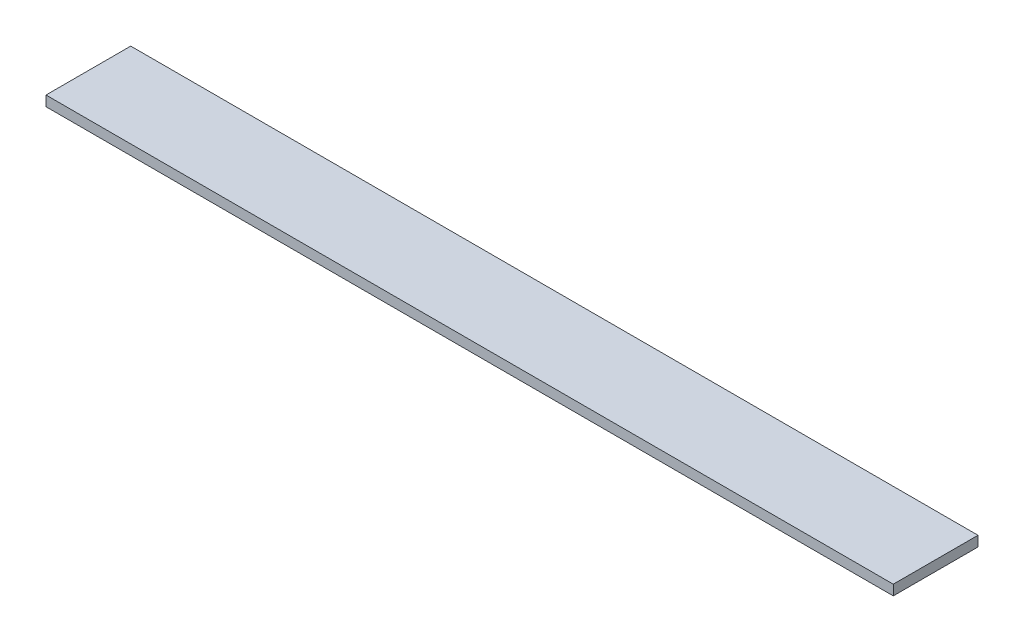
ISO-10303-21;
HEADER;
FILE_DESCRIPTION(('STEP AP214'),'2;1');
FILE_NAME('part.step','',(''),(''),'','','');
FILE_SCHEMA(('AUTOMOTIVE_DESIGN { 1 0 10303 214 1 1 1 1 }'));
ENDSEC;
DATA;
#1=APPLICATION_CONTEXT('core data for automotive mechanical design processes');
#2=APPLICATION_PROTOCOL_DEFINITION('international standard','automotive_design',2000,#1);
#3=PRODUCT_CONTEXT('',#1,'mechanical');
#4=PRODUCT('Part','Part','',(#3));
#5=PRODUCT_RELATED_PRODUCT_CATEGORY('part','',(#4));
#6=PRODUCT_DEFINITION_FORMATION('','',#4);
#7=PRODUCT_DEFINITION_CONTEXT('part definition',#1,'design');
#8=PRODUCT_DEFINITION('design','',#6,#7);
#9=PRODUCT_DEFINITION_SHAPE('','',#8);
#10=(LENGTH_UNIT() NAMED_UNIT(*) SI_UNIT(.MILLI.,.METRE.));
#11=(NAMED_UNIT(*) PLANE_ANGLE_UNIT() SI_UNIT($,.RADIAN.));
#12=(NAMED_UNIT(*) SI_UNIT($,.STERADIAN.) SOLID_ANGLE_UNIT());
#13=UNCERTAINTY_MEASURE_WITH_UNIT(LENGTH_MEASURE(1.E-05),#10,'distance_accuracy_value','');
#14=(GEOMETRIC_REPRESENTATION_CONTEXT(3) GLOBAL_UNCERTAINTY_ASSIGNED_CONTEXT((#13)) GLOBAL_UNIT_ASSIGNED_CONTEXT((#10,
#11,#12)) REPRESENTATION_CONTEXT('',''));
#15=CARTESIAN_POINT('',(0.,0.,0.));
#16=DIRECTION('',(0.,0.,1.));
#17=DIRECTION('',(1.,0.,0.));
#18=AXIS2_PLACEMENT_3D('',#15,#16,#17);
#19=CARTESIAN_POINT('',(0.,30.,0.));
#20=DIRECTION('',(1.,0.,0.));
#21=DIRECTION('',(0.,0.,-1.));
#22=AXIS2_PLACEMENT_3D('',#19,#20,#21);
#23=PLANE('',#22);
#24=DIRECTION('',(0.,0.,1.));
#25=VECTOR('',#24,1.);
#26=CARTESIAN_POINT('',(0.,0.,0.));
#27=LINE('',#26,#25);
#28=CARTESIAN_POINT('',(0.,0.,-250.));
#29=VERTEX_POINT('',#28);
#30=CARTESIAN_POINT('',(0.,0.,0.));
#31=VERTEX_POINT('',#30);
#32=EDGE_CURVE('E96',#29,#31,#27,.T.);
#33=ORIENTED_EDGE('',*,*,#32,.T.);
#34=DIRECTION('',(0.,-1.,0.));
#35=VECTOR('',#34,1.);
#36=CARTESIAN_POINT('',(0.,30.,0.));
#37=LINE('',#36,#35);
#38=CARTESIAN_POINT('',(0.,30.,0.));
#39=VERTEX_POINT('',#38);
#40=EDGE_CURVE('E11',#39,#31,#37,.T.);
#41=ORIENTED_EDGE('',*,*,#40,.F.);
#42=DIRECTION('',(0.,0.,1.));
#43=VECTOR('',#42,1.);
#44=CARTESIAN_POINT('',(0.,30.,0.));
#45=LINE('',#44,#43);
#46=CARTESIAN_POINT('',(0.,30.,-250.));
#47=VERTEX_POINT('',#46);
#48=EDGE_CURVE('E84',#47,#39,#45,.T.);
#49=ORIENTED_EDGE('',*,*,#48,.F.);
#50=DIRECTION('',(0.,-1.,0.));
#51=VECTOR('',#50,1.);
#52=CARTESIAN_POINT('',(0.,30.,-250.));
#53=LINE('',#52,#51);
#54=EDGE_CURVE('E92',#47,#29,#53,.T.);
#55=ORIENTED_EDGE('',*,*,#54,.T.);
#56=EDGE_LOOP('',(#33,#41,#49,#55));
#57=FACE_BOUND('',#56,.T.);
#58=ADVANCED_FACE('F33',(#57),#23,.F.);
#59=CARTESIAN_POINT('',(0.,30.,0.));
#60=DIRECTION('',(0.,0.,-1.));
#61=DIRECTION('',(-1.,0.,0.));
#62=AXIS2_PLACEMENT_3D('',#59,#60,#61);
#63=PLANE('',#62);
#64=DIRECTION('',(1.,0.,0.));
#65=VECTOR('',#64,1.);
#66=CARTESIAN_POINT('',(0.,0.,0.));
#67=LINE('',#66,#65);
#68=CARTESIAN_POINT('',(2500.,0.,0.));
#69=VERTEX_POINT('',#68);
#70=EDGE_CURVE('E88',#31,#69,#67,.T.);
#71=ORIENTED_EDGE('',*,*,#70,.T.);
#72=DIRECTION('',(0.,-1.,0.));
#73=VECTOR('',#72,1.);
#74=CARTESIAN_POINT('',(2500.,30.,0.));
#75=LINE('',#74,#73);
#76=CARTESIAN_POINT('',(2500.,30.,0.));
#77=VERTEX_POINT('',#76);
#78=EDGE_CURVE('E41',#77,#69,#75,.T.);
#79=ORIENTED_EDGE('',*,*,#78,.F.);
#80=DIRECTION('',(1.,0.,0.));
#81=VECTOR('',#80,1.);
#82=CARTESIAN_POINT('',(0.,30.,0.));
#83=LINE('',#82,#81);
#84=EDGE_CURVE('E79',#39,#77,#83,.T.);
#85=ORIENTED_EDGE('',*,*,#84,.F.);
#86=ORIENTED_EDGE('',*,*,#40,.T.);
#87=EDGE_LOOP('',(#71,#79,#85,#86));
#88=FACE_BOUND('',#87,.T.);
#89=ADVANCED_FACE('F87',(#88),#63,.F.);
#90=CARTESIAN_POINT('',(2500.,30.,0.));
#91=DIRECTION('',(-1.,0.,0.));
#92=DIRECTION('',(0.,0.,1.));
#93=AXIS2_PLACEMENT_3D('',#90,#91,#92);
#94=PLANE('',#93);
#95=DIRECTION('',(0.,0.,-1.));
#96=VECTOR('',#95,1.);
#97=CARTESIAN_POINT('',(2500.,0.,0.));
#98=LINE('',#97,#96);
#99=CARTESIAN_POINT('',(2500.,0.,-250.));
#100=VERTEX_POINT('',#99);
#101=EDGE_CURVE('E66',#69,#100,#98,.T.);
#102=ORIENTED_EDGE('',*,*,#101,.T.);
#103=DIRECTION('',(0.,-1.,0.));
#104=VECTOR('',#103,1.);
#105=CARTESIAN_POINT('',(2500.,30.,-250.));
#106=LINE('',#105,#104);
#107=CARTESIAN_POINT('',(2500.,30.,-250.));
#108=VERTEX_POINT('',#107);
#109=EDGE_CURVE('E89',#108,#100,#106,.T.);
#110=ORIENTED_EDGE('',*,*,#109,.F.);
#111=DIRECTION('',(0.,0.,-1.));
#112=VECTOR('',#111,1.);
#113=CARTESIAN_POINT('',(2500.,30.,0.));
#114=LINE('',#113,#112);
#115=EDGE_CURVE('E82',#77,#108,#114,.T.);
#116=ORIENTED_EDGE('',*,*,#115,.F.);
#117=ORIENTED_EDGE('',*,*,#78,.T.);
#118=EDGE_LOOP('',(#102,#110,#116,#117));
#119=FACE_BOUND('',#118,.T.);
#120=ADVANCED_FACE('F90',(#119),#94,.F.);
#121=CARTESIAN_POINT('',(0.,30.,-250.));
#122=DIRECTION('',(0.,0.,1.));
#123=DIRECTION('',(1.,0.,0.));
#124=AXIS2_PLACEMENT_3D('',#121,#122,#123);
#125=PLANE('',#124);
#126=DIRECTION('',(-1.,0.,0.));
#127=VECTOR('',#126,1.);
#128=CARTESIAN_POINT('',(0.,0.,-250.));
#129=LINE('',#128,#127);
#130=EDGE_CURVE('E72',#100,#29,#129,.T.);
#131=ORIENTED_EDGE('',*,*,#130,.T.);
#132=ORIENTED_EDGE('',*,*,#54,.F.);
#133=DIRECTION('',(-1.,0.,0.));
#134=VECTOR('',#133,1.);
#135=CARTESIAN_POINT('',(0.,30.,-250.));
#136=LINE('',#135,#134);
#137=EDGE_CURVE('E49',#108,#47,#136,.T.);
#138=ORIENTED_EDGE('',*,*,#137,.F.);
#139=ORIENTED_EDGE('',*,*,#109,.T.);
#140=EDGE_LOOP('',(#131,#132,#138,#139));
#141=FACE_BOUND('',#140,.T.);
#142=ADVANCED_FACE('F103',(#141),#125,.F.);
#143=CARTESIAN_POINT('',(0.,30.,0.));
#144=DIRECTION('',(0.,-1.,0.));
#145=DIRECTION('',(0.,0.,-1.));
#146=AXIS2_PLACEMENT_3D('',#143,#144,#145);
#147=PLANE('',#146);
#148=ORIENTED_EDGE('',*,*,#48,.T.);
#149=ORIENTED_EDGE('',*,*,#84,.T.);
#150=ORIENTED_EDGE('',*,*,#115,.T.);
#151=ORIENTED_EDGE('',*,*,#137,.T.);
#152=EDGE_LOOP('',(#148,#149,#150,#151));
#153=FACE_BOUND('',#152,.T.);
#154=ADVANCED_FACE('F80',(#153),#147,.F.);
#155=CARTESIAN_POINT('',(0.,0.,0.));
#156=DIRECTION('',(0.,-1.,0.));
#157=DIRECTION('',(0.,0.,-1.));
#158=AXIS2_PLACEMENT_3D('',#155,#156,#157);
#159=PLANE('',#158);
#160=ORIENTED_EDGE('',*,*,#32,.F.);
#161=ORIENTED_EDGE('',*,*,#130,.F.);
#162=ORIENTED_EDGE('',*,*,#101,.F.);
#163=ORIENTED_EDGE('',*,*,#70,.F.);
#164=EDGE_LOOP('',(#160,#161,#162,#163));
#165=FACE_BOUND('',#164,.T.);
#166=ADVANCED_FACE('F106',(#165),#159,.T.);
#167=CLOSED_SHELL('',(#58,#89,#120,#142,#154,#166));
#168=MANIFOLD_SOLID_BREP('B2',#167);
#169=ADVANCED_BREP_SHAPE_REPRESENTATION('',(#18,#168),#14);
#170=SHAPE_DEFINITION_REPRESENTATION(#9,#169);
ENDSEC;
END-ISO-10303-21;
